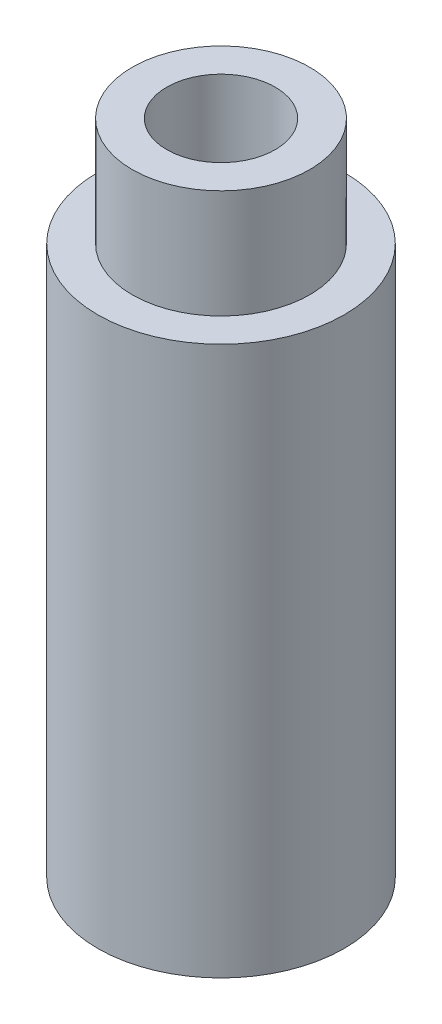
ISO-10303-21;
HEADER;
FILE_DESCRIPTION(('STEP AP214'),'2;1');
FILE_NAME('part.step','',(''),(''),'','','');
FILE_SCHEMA(('AUTOMOTIVE_DESIGN { 1 0 10303 214 1 1 1 1 }'));
ENDSEC;
DATA;
#1=APPLICATION_CONTEXT('core data for automotive mechanical design processes');
#2=APPLICATION_PROTOCOL_DEFINITION('international standard','automotive_design',2000,#1);
#3=PRODUCT_CONTEXT('',#1,'mechanical');
#4=PRODUCT('Part','Part','',(#3));
#5=PRODUCT_RELATED_PRODUCT_CATEGORY('part','',(#4));
#6=PRODUCT_DEFINITION_FORMATION('','',#4);
#7=PRODUCT_DEFINITION_CONTEXT('part definition',#1,'design');
#8=PRODUCT_DEFINITION('design','',#6,#7);
#9=PRODUCT_DEFINITION_SHAPE('','',#8);
#10=(LENGTH_UNIT() NAMED_UNIT(*) SI_UNIT(.MILLI.,.METRE.));
#11=(NAMED_UNIT(*) PLANE_ANGLE_UNIT() SI_UNIT($,.RADIAN.));
#12=(NAMED_UNIT(*) SI_UNIT($,.STERADIAN.) SOLID_ANGLE_UNIT());
#13=UNCERTAINTY_MEASURE_WITH_UNIT(LENGTH_MEASURE(1.E-05),#10,'distance_accuracy_value','');
#14=(GEOMETRIC_REPRESENTATION_CONTEXT(3) GLOBAL_UNCERTAINTY_ASSIGNED_CONTEXT((#13)) GLOBAL_UNIT_ASSIGNED_CONTEXT((#10,
#11,#12)) REPRESENTATION_CONTEXT('',''));
#15=CARTESIAN_POINT('',(0.,0.,0.));
#16=DIRECTION('',(0.,0.,1.));
#17=DIRECTION('',(1.,0.,0.));
#18=AXIS2_PLACEMENT_3D('',#15,#16,#17);
#19=CARTESIAN_POINT('',(0.,40.,0.));
#20=DIRECTION('',(0.,1.,0.));
#21=DIRECTION('',(0.,0.,1.));
#22=AXIS2_PLACEMENT_3D('',#19,#20,#21);
#23=PLANE('',#22);
#24=CARTESIAN_POINT('',(0.,40.,0.));
#25=DIRECTION('',(0.,1.,0.));
#26=DIRECTION('',(0.,0.,1.));
#27=AXIS2_PLACEMENT_3D('',#24,#25,#26);
#28=CIRCLE('',#27,5.4);
#29=CARTESIAN_POINT('',(0.,40.,5.4));
#30=VERTEX_POINT('',#29);
#31=EDGE_CURVE('E10',#30,#30,#28,.T.);
#32=ORIENTED_EDGE('',*,*,#31,.T.);
#33=EDGE_LOOP('',(#32));
#34=FACE_BOUND('',#33,.T.);
#35=CARTESIAN_POINT('',(0.,40.,0.));
#36=DIRECTION('',(0.,1.,0.));
#37=DIRECTION('',(0.,0.,1.));
#38=AXIS2_PLACEMENT_3D('',#35,#36,#37);
#39=CIRCLE('',#38,3.3);
#40=CARTESIAN_POINT('',(0.,40.,3.3));
#41=VERTEX_POINT('',#40);
#42=EDGE_CURVE('E51',#41,#41,#39,.T.);
#43=ORIENTED_EDGE('',*,*,#42,.F.);
#44=EDGE_LOOP('',(#43));
#45=FACE_BOUND('',#44,.T.);
#46=ADVANCED_FACE('F43',(#34,#45),#23,.T.);
#47=CARTESIAN_POINT('',(0.,0.,0.));
#48=DIRECTION('',(0.,1.,0.));
#49=DIRECTION('',(0.,0.,1.));
#50=AXIS2_PLACEMENT_3D('',#47,#48,#49);
#51=PLANE('',#50);
#52=CARTESIAN_POINT('',(0.,0.,0.));
#53=DIRECTION('',(0.,1.,0.));
#54=DIRECTION('',(0.,0.,1.));
#55=AXIS2_PLACEMENT_3D('',#52,#53,#54);
#56=CIRCLE('',#55,3.3);
#57=CARTESIAN_POINT('',(0.,0.,3.3));
#58=VERTEX_POINT('',#57);
#59=EDGE_CURVE('E56',#58,#58,#56,.T.);
#60=ORIENTED_EDGE('',*,*,#59,.T.);
#61=EDGE_LOOP('',(#60));
#62=FACE_BOUND('',#61,.T.);
#63=CARTESIAN_POINT('',(0.,0.,0.));
#64=DIRECTION('',(0.,1.,0.));
#65=DIRECTION('',(0.,0.,1.));
#66=AXIS2_PLACEMENT_3D('',#63,#64,#65);
#67=CIRCLE('',#66,7.5);
#68=CARTESIAN_POINT('',(0.,0.,7.5));
#69=VERTEX_POINT('',#68);
#70=EDGE_CURVE('E67',#69,#69,#67,.F.);
#71=ORIENTED_EDGE('',*,*,#70,.T.);
#72=EDGE_LOOP('',(#71));
#73=FACE_BOUND('',#72,.T.);
#74=ADVANCED_FACE('F76',(#62,#73),#51,.F.);
#75=CARTESIAN_POINT('',(0.,40.,0.));
#76=DIRECTION('',(0.,-1.,0.));
#77=DIRECTION('',(0.,0.,-1.));
#78=AXIS2_PLACEMENT_3D('',#75,#76,#77);
#79=CYLINDRICAL_SURFACE('',#78,5.4);
#80=CARTESIAN_POINT('',(0.,33.4,0.));
#81=DIRECTION('',(0.,1.,0.));
#82=DIRECTION('',(0.,0.,1.));
#83=AXIS2_PLACEMENT_3D('',#80,#81,#82);
#84=CIRCLE('',#83,5.4);
#85=CARTESIAN_POINT('',(0.,33.4,5.4));
#86=VERTEX_POINT('',#85);
#87=EDGE_CURVE('E62',#86,#86,#84,.T.);
#88=ORIENTED_EDGE('',*,*,#87,.T.);
#89=EDGE_LOOP('',(#88));
#90=FACE_BOUND('',#89,.T.);
#91=ORIENTED_EDGE('',*,*,#31,.F.);
#92=EDGE_LOOP('',(#91));
#93=FACE_BOUND('',#92,.T.);
#94=ADVANCED_FACE('F45',(#90,#93),#79,.T.);
#95=CARTESIAN_POINT('',(0.,40.,0.));
#96=DIRECTION('',(0.,-1.,0.));
#97=DIRECTION('',(0.,0.,-1.));
#98=AXIS2_PLACEMENT_3D('',#95,#96,#97);
#99=CYLINDRICAL_SURFACE('',#98,3.3);
#100=ORIENTED_EDGE('',*,*,#42,.T.);
#101=EDGE_LOOP('',(#100));
#102=FACE_BOUND('',#101,.T.);
#103=ORIENTED_EDGE('',*,*,#59,.F.);
#104=EDGE_LOOP('',(#103));
#105=FACE_BOUND('',#104,.T.);
#106=ADVANCED_FACE('F87',(#102,#105),#99,.F.);
#107=CARTESIAN_POINT('',(0.,33.4,0.));
#108=DIRECTION('',(0.,1.,0.));
#109=DIRECTION('',(0.,0.,1.));
#110=AXIS2_PLACEMENT_3D('',#107,#108,#109);
#111=PLANE('',#110);
#112=CARTESIAN_POINT('',(0.,33.4,0.));
#113=DIRECTION('',(0.,1.,0.));
#114=DIRECTION('',(0.,0.,1.));
#115=AXIS2_PLACEMENT_3D('',#112,#113,#114);
#116=CIRCLE('',#115,7.5);
#117=CARTESIAN_POINT('',(0.,33.4,7.5));
#118=VERTEX_POINT('',#117);
#119=EDGE_CURVE('E68',#118,#118,#116,.T.);
#120=ORIENTED_EDGE('',*,*,#119,.T.);
#121=EDGE_LOOP('',(#120));
#122=FACE_BOUND('',#121,.T.);
#123=ORIENTED_EDGE('',*,*,#87,.F.);
#124=EDGE_LOOP('',(#123));
#125=FACE_BOUND('',#124,.T.);
#126=ADVANCED_FACE('F81',(#122,#125),#111,.T.);
#127=CARTESIAN_POINT('',(0.,-21.2132034355964,0.));
#128=DIRECTION('',(0.,1.,0.));
#129=DIRECTION('',(0.,0.,1.));
#130=AXIS2_PLACEMENT_3D('',#127,#128,#129);
#131=CYLINDRICAL_SURFACE('',#130,7.5);
#132=CARTESIAN_POINT('',(0.,0.,7.5));
#133=CARTESIAN_POINT('',(0.,0.347916666666663,7.5));
#134=CARTESIAN_POINT('',(0.,0.69583333333333,7.5));
#135=CARTESIAN_POINT('',(0.,1.39166666666666,7.5));
#136=CARTESIAN_POINT('',(0.,1.73958333333333,7.5));
#137=CARTESIAN_POINT('',(0.,2.43541666666666,7.5));
#138=CARTESIAN_POINT('',(0.,2.78333333333333,7.5));
#139=CARTESIAN_POINT('',(0.,3.47916666666666,7.5));
#140=CARTESIAN_POINT('',(0.,3.82708333333333,7.5));
#141=CARTESIAN_POINT('',(0.,4.52291666666666,7.5));
#142=CARTESIAN_POINT('',(0.,4.87083333333333,7.5));
#143=CARTESIAN_POINT('',(0.,5.56666666666666,7.5));
#144=CARTESIAN_POINT('',(0.,5.91458333333333,7.5));
#145=CARTESIAN_POINT('',(0.,6.61041666666666,7.5));
#146=CARTESIAN_POINT('',(0.,6.95833333333333,7.5));
#147=CARTESIAN_POINT('',(0.,7.65416666666666,7.5));
#148=CARTESIAN_POINT('',(0.,8.00208333333333,7.5));
#149=CARTESIAN_POINT('',(0.,8.69791666666666,7.5));
#150=CARTESIAN_POINT('',(0.,9.04583333333333,7.5));
#151=CARTESIAN_POINT('',(0.,9.74166666666666,7.5));
#152=CARTESIAN_POINT('',(0.,10.0895833333333,7.5));
#153=CARTESIAN_POINT('',(0.,10.7854166666667,7.5));
#154=CARTESIAN_POINT('',(0.,11.1333333333333,7.5));
#155=CARTESIAN_POINT('',(0.,11.8291666666667,7.5));
#156=CARTESIAN_POINT('',(0.,12.1770833333333,7.5));
#157=CARTESIAN_POINT('',(0.,12.8729166666667,7.5));
#158=CARTESIAN_POINT('',(0.,13.2208333333333,7.5));
#159=CARTESIAN_POINT('',(0.,13.9166666666667,7.5));
#160=CARTESIAN_POINT('',(0.,14.2645833333333,7.5));
#161=CARTESIAN_POINT('',(0.,14.9604166666667,7.5));
#162=CARTESIAN_POINT('',(0.,15.3083333333333,7.5));
#163=CARTESIAN_POINT('',(0.,16.0041666666667,7.5));
#164=CARTESIAN_POINT('',(0.,16.3520833333333,7.5));
#165=CARTESIAN_POINT('',(0.,17.0479166666667,7.5));
#166=CARTESIAN_POINT('',(0.,17.3958333333333,7.5));
#167=CARTESIAN_POINT('',(0.,18.0916666666667,7.5));
#168=CARTESIAN_POINT('',(0.,18.4395833333333,7.5));
#169=CARTESIAN_POINT('',(0.,19.1354166666667,7.5));
#170=CARTESIAN_POINT('',(0.,19.4833333333333,7.5));
#171=CARTESIAN_POINT('',(0.,20.1791666666667,7.5));
#172=CARTESIAN_POINT('',(0.,20.5270833333333,7.5));
#173=CARTESIAN_POINT('',(0.,21.2229166666667,7.5));
#174=CARTESIAN_POINT('',(0.,21.5708333333333,7.5));
#175=CARTESIAN_POINT('',(0.,22.2666666666667,7.5));
#176=CARTESIAN_POINT('',(0.,22.6145833333333,7.5));
#177=CARTESIAN_POINT('',(0.,23.3104166666667,7.5));
#178=CARTESIAN_POINT('',(0.,23.6583333333333,7.5));
#179=CARTESIAN_POINT('',(0.,24.3541666666667,7.5));
#180=CARTESIAN_POINT('',(0.,24.7020833333333,7.5));
#181=CARTESIAN_POINT('',(0.,25.3979166666667,7.5));
#182=CARTESIAN_POINT('',(0.,25.7458333333333,7.5));
#183=CARTESIAN_POINT('',(0.,26.4416666666667,7.5));
#184=CARTESIAN_POINT('',(0.,26.7895833333333,7.5));
#185=CARTESIAN_POINT('',(0.,27.4854166666667,7.5));
#186=CARTESIAN_POINT('',(0.,27.8333333333333,7.5));
#187=CARTESIAN_POINT('',(0.,28.5291666666667,7.5));
#188=CARTESIAN_POINT('',(0.,28.8770833333333,7.5));
#189=CARTESIAN_POINT('',(0.,29.5729166666667,7.5));
#190=CARTESIAN_POINT('',(0.,29.9208333333333,7.5));
#191=CARTESIAN_POINT('',(0.,30.6166666666667,7.5));
#192=CARTESIAN_POINT('',(0.,30.9645833333333,7.5));
#193=CARTESIAN_POINT('',(0.,31.6604166666667,7.5));
#194=CARTESIAN_POINT('',(0.,32.0083333333333,7.5));
#195=CARTESIAN_POINT('',(0.,32.7041666666667,7.5));
#196=CARTESIAN_POINT('',(0.,33.0520833333333,7.5));
#197=CARTESIAN_POINT('',(0.,33.4,7.5));
#198=B_SPLINE_CURVE_WITH_KNOTS('',3,(#132,#133,#134,#135,#136,#137,#138,#139,#140,#141,#142,
#143,#144,#145,#146,#147,#148,#149,#150,#151,#152,#153,#154,#155,#156,#157,#158,#159,#160,#161,
#162,#163,#164,#165,#166,#167,#168,#169,#170,#171,#172,#173,#174,#175,#176,#177,#178,#179,#180,
#181,#182,#183,#184,#185,#186,#187,#188,#189,#190,#191,#192,#193,#194,#195,#196,#197),
.UNSPECIFIED.,.F.,.F.,(4,2,2,2,2,2,2,2,2,2,2,2,2,2,2,2,2,2,2,2,2,2,2,2,2,2,2,2,2,2,2,2,4),(0.,
1.04375,2.0875,3.13125,4.175,5.21875,6.2625,7.30625,8.35,9.39375,10.4375,11.48125,12.525,
13.56875,14.6125,15.65625,16.7,17.74375,18.7875,19.83125,20.875,21.91875,22.9625,24.00625,25.05,
26.09375,27.1375,28.18125,29.225,30.26875,31.3125,32.35625,33.4),.UNSPECIFIED.);
#199=EDGE_CURVE('BSEAM78',#69,#118,#198,.T.);
#200=ORIENTED_EDGE('',*,*,#70,.F.);
#201=ORIENTED_EDGE('',*,*,#119,.F.);
#202=ORIENTED_EDGE('',*,*,#199,.T.);
#203=ORIENTED_EDGE('',*,*,#199,.F.);
#204=EDGE_LOOP('',(#200,#202,#201,#203));
#205=FACE_BOUND('',#204,.T.);
#206=ADVANCED_FACE('F78',(#205),#131,.T.);
#207=CLOSED_SHELL('',(#46,#74,#94,#106,#126,#206));
#208=MANIFOLD_SOLID_BREP('B2',#207);
#209=ADVANCED_BREP_SHAPE_REPRESENTATION('',(#18,#208),#14);
#210=SHAPE_DEFINITION_REPRESENTATION(#9,#209);
ENDSEC;
END-ISO-10303-21;
